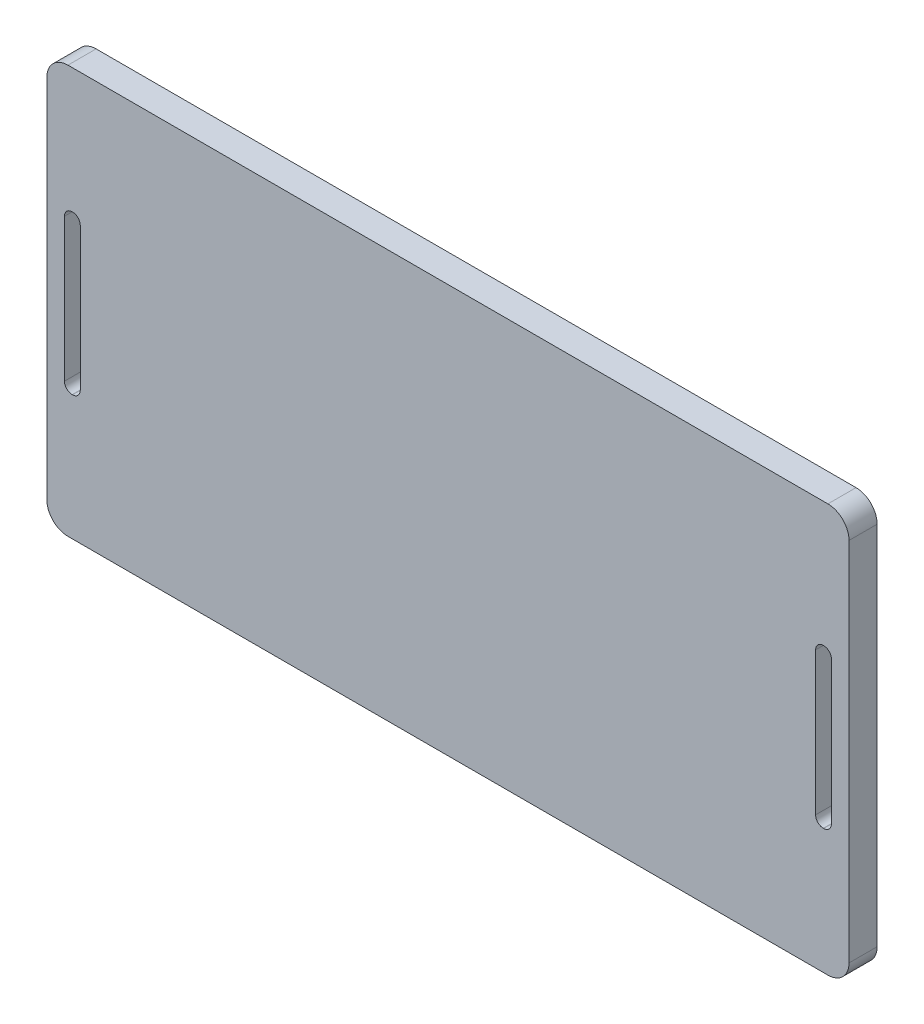
ISO-10303-21;
HEADER;
FILE_DESCRIPTION(('STEP AP214'),'2;1');
FILE_NAME('part.step','',(''),(''),'','','');
FILE_SCHEMA(('AUTOMOTIVE_DESIGN { 1 0 10303 214 1 1 1 1 }'));
ENDSEC;
DATA;
#1=APPLICATION_CONTEXT('core data for automotive mechanical design processes');
#2=APPLICATION_PROTOCOL_DEFINITION('international standard','automotive_design',2000,#1);
#3=PRODUCT_CONTEXT('',#1,'mechanical');
#4=PRODUCT('Part','Part','',(#3));
#5=PRODUCT_RELATED_PRODUCT_CATEGORY('part','',(#4));
#6=PRODUCT_DEFINITION_FORMATION('','',#4);
#7=PRODUCT_DEFINITION_CONTEXT('part definition',#1,'design');
#8=PRODUCT_DEFINITION('design','',#6,#7);
#9=PRODUCT_DEFINITION_SHAPE('','',#8);
#10=(LENGTH_UNIT() NAMED_UNIT(*) SI_UNIT(.MILLI.,.METRE.));
#11=(NAMED_UNIT(*) PLANE_ANGLE_UNIT() SI_UNIT($,.RADIAN.));
#12=(NAMED_UNIT(*) SI_UNIT($,.STERADIAN.) SOLID_ANGLE_UNIT());
#13=UNCERTAINTY_MEASURE_WITH_UNIT(LENGTH_MEASURE(1.E-05),#10,'distance_accuracy_value','');
#14=(GEOMETRIC_REPRESENTATION_CONTEXT(3) GLOBAL_UNCERTAINTY_ASSIGNED_CONTEXT((#13)) GLOBAL_UNIT_ASSIGNED_CONTEXT((#10,
#11,#12)) REPRESENTATION_CONTEXT('',''));
#15=CARTESIAN_POINT('',(0.,0.,0.));
#16=DIRECTION('',(0.,0.,1.));
#17=DIRECTION('',(1.,0.,0.));
#18=AXIS2_PLACEMENT_3D('',#15,#16,#17);
#19=CARTESIAN_POINT('',(830.835603050682,819.114300050581,8.));
#20=DIRECTION('',(0.,0.,-1.));
#21=DIRECTION('',(-1.,0.,0.));
#22=AXIS2_PLACEMENT_3D('',#19,#20,#21);
#23=CYLINDRICAL_SURFACE('',#22,6.00000000000001);
#24=CARTESIAN_POINT('',(830.835603050682,819.114300050581,0.));
#25=DIRECTION('',(0.,0.,1.));
#26=DIRECTION('',(-1.,0.,0.));
#27=AXIS2_PLACEMENT_3D('',#24,#25,#26);
#28=CIRCLE('',#27,6.00000000000001);
#29=CARTESIAN_POINT('',(836.835603050682,819.114300050581,0.));
#30=VERTEX_POINT('',#29);
#31=CARTESIAN_POINT('',(830.835603050682,825.114300050581,0.));
#32=VERTEX_POINT('',#31);
#33=EDGE_CURVE('E334',#30,#32,#28,.T.);
#34=ORIENTED_EDGE('',*,*,#33,.T.);
#35=DIRECTION('',(0.,0.,-1.));
#36=VECTOR('',#35,1.);
#37=CARTESIAN_POINT('',(830.835603050682,825.114300050581,8.));
#38=LINE('',#37,#36);
#39=CARTESIAN_POINT('',(830.835603050682,825.114300050581,8.));
#40=VERTEX_POINT('',#39);
#41=EDGE_CURVE('E11',#40,#32,#38,.T.);
#42=ORIENTED_EDGE('',*,*,#41,.F.);
#43=CARTESIAN_POINT('',(830.835603050682,819.114300050581,8.));
#44=DIRECTION('',(0.,0.,1.));
#45=DIRECTION('',(-1.,0.,0.));
#46=AXIS2_PLACEMENT_3D('',#43,#44,#45);
#47=CIRCLE('',#46,6.00000000000001);
#48=CARTESIAN_POINT('',(836.835603050682,819.114300050581,8.));
#49=VERTEX_POINT('',#48);
#50=EDGE_CURVE('E331',#49,#40,#47,.T.);
#51=ORIENTED_EDGE('',*,*,#50,.F.);
#52=DIRECTION('',(0.,0.,-1.));
#53=VECTOR('',#52,1.);
#54=CARTESIAN_POINT('',(836.835603050682,819.114300050581,8.));
#55=LINE('',#54,#53);
#56=EDGE_CURVE('E355',#49,#30,#55,.T.);
#57=ORIENTED_EDGE('',*,*,#56,.T.);
#58=EDGE_LOOP('',(#34,#42,#51,#57));
#59=FACE_BOUND('',#58,.T.);
#60=ADVANCED_FACE('F36',(#59),#23,.T.);
#61=CARTESIAN_POINT('',(614.835603050682,825.114300050581,8.));
#62=DIRECTION('',(0.,-1.,0.));
#63=DIRECTION('',(0.,0.,-1.));
#64=AXIS2_PLACEMENT_3D('',#61,#62,#63);
#65=PLANE('',#64);
#66=DIRECTION('',(-1.,0.,0.));
#67=VECTOR('',#66,1.);
#68=CARTESIAN_POINT('',(614.835603050682,825.114300050581,0.));
#69=LINE('',#68,#67);
#70=CARTESIAN_POINT('',(614.835603050682,825.114300050581,0.));
#71=VERTEX_POINT('',#70);
#72=EDGE_CURVE('E353',#32,#71,#69,.T.);
#73=ORIENTED_EDGE('',*,*,#72,.T.);
#74=DIRECTION('',(0.,0.,-1.));
#75=VECTOR('',#74,1.);
#76=CARTESIAN_POINT('',(614.835603050682,825.114300050581,8.));
#77=LINE('',#76,#75);
#78=CARTESIAN_POINT('',(614.835603050682,825.114300050581,8.));
#79=VERTEX_POINT('',#78);
#80=EDGE_CURVE('E44',#79,#71,#77,.T.);
#81=ORIENTED_EDGE('',*,*,#80,.F.);
#82=DIRECTION('',(-1.,0.,0.));
#83=VECTOR('',#82,1.);
#84=CARTESIAN_POINT('',(614.835603050682,825.114300050581,8.));
#85=LINE('',#84,#83);
#86=EDGE_CURVE('E340',#40,#79,#85,.T.);
#87=ORIENTED_EDGE('',*,*,#86,.F.);
#88=ORIENTED_EDGE('',*,*,#41,.T.);
#89=EDGE_LOOP('',(#73,#81,#87,#88));
#90=FACE_BOUND('',#89,.T.);
#91=ADVANCED_FACE('F411',(#90),#65,.F.);
#92=CARTESIAN_POINT('',(614.835603050682,819.114300050581,8.));
#93=DIRECTION('',(0.,0.,-1.));
#94=DIRECTION('',(-1.,0.,0.));
#95=AXIS2_PLACEMENT_3D('',#92,#93,#94);
#96=CYLINDRICAL_SURFACE('',#95,6.00000000000001);
#97=CARTESIAN_POINT('',(614.835603050682,819.114300050581,0.));
#98=DIRECTION('',(0.,0.,1.));
#99=DIRECTION('',(1.,0.,0.));
#100=AXIS2_PLACEMENT_3D('',#97,#98,#99);
#101=CIRCLE('',#100,6.00000000000001);
#102=CARTESIAN_POINT('',(608.835603050682,819.114300050581,0.));
#103=VERTEX_POINT('',#102);
#104=EDGE_CURVE('E360',#71,#103,#101,.T.);
#105=ORIENTED_EDGE('',*,*,#104,.T.);
#106=DIRECTION('',(0.,0.,-1.));
#107=VECTOR('',#106,1.);
#108=CARTESIAN_POINT('',(608.835603050682,819.114300050581,8.));
#109=LINE('',#108,#107);
#110=CARTESIAN_POINT('',(608.835603050682,819.114300050581,8.));
#111=VERTEX_POINT('',#110);
#112=EDGE_CURVE('E385',#111,#103,#109,.T.);
#113=ORIENTED_EDGE('',*,*,#112,.F.);
#114=CARTESIAN_POINT('',(614.835603050682,819.114300050581,8.));
#115=DIRECTION('',(0.,0.,1.));
#116=DIRECTION('',(1.,0.,0.));
#117=AXIS2_PLACEMENT_3D('',#114,#115,#116);
#118=CIRCLE('',#117,6.00000000000001);
#119=EDGE_CURVE('E338',#79,#111,#118,.T.);
#120=ORIENTED_EDGE('',*,*,#119,.F.);
#121=ORIENTED_EDGE('',*,*,#80,.T.);
#122=EDGE_LOOP('',(#105,#113,#120,#121));
#123=FACE_BOUND('',#122,.T.);
#124=ADVANCED_FACE('F386',(#123),#96,.T.);
#125=CARTESIAN_POINT('',(608.835603050682,715.114300050581,8.));
#126=DIRECTION('',(1.,0.,0.));
#127=DIRECTION('',(0.,0.,-1.));
#128=AXIS2_PLACEMENT_3D('',#125,#126,#127);
#129=PLANE('',#128);
#130=DIRECTION('',(0.,-1.,0.));
#131=VECTOR('',#130,1.);
#132=CARTESIAN_POINT('',(608.835603050682,715.114300050581,0.));
#133=LINE('',#132,#131);
#134=CARTESIAN_POINT('',(608.835603050682,715.114300050581,0.));
#135=VERTEX_POINT('',#134);
#136=EDGE_CURVE('E357',#103,#135,#133,.T.);
#137=ORIENTED_EDGE('',*,*,#136,.T.);
#138=DIRECTION('',(0.,0.,-1.));
#139=VECTOR('',#138,1.);
#140=CARTESIAN_POINT('',(608.835603050682,715.114300050581,8.));
#141=LINE('',#140,#139);
#142=CARTESIAN_POINT('',(608.835603050682,715.114300050581,8.));
#143=VERTEX_POINT('',#142);
#144=EDGE_CURVE('E377',#143,#135,#141,.T.);
#145=ORIENTED_EDGE('',*,*,#144,.F.);
#146=DIRECTION('',(0.,-1.,0.));
#147=VECTOR('',#146,1.);
#148=CARTESIAN_POINT('',(608.835603050682,715.114300050581,8.));
#149=LINE('',#148,#147);
#150=EDGE_CURVE('E345',#111,#143,#149,.T.);
#151=ORIENTED_EDGE('',*,*,#150,.F.);
#152=ORIENTED_EDGE('',*,*,#112,.T.);
#153=EDGE_LOOP('',(#137,#145,#151,#152));
#154=FACE_BOUND('',#153,.T.);
#155=ADVANCED_FACE('F397',(#154),#129,.F.);
#156=CARTESIAN_POINT('',(614.835603050682,715.114300050581,8.));
#157=DIRECTION('',(0.,0.,-1.));
#158=DIRECTION('',(-1.,0.,0.));
#159=AXIS2_PLACEMENT_3D('',#156,#157,#158);
#160=CYLINDRICAL_SURFACE('',#159,6.00000000000001);
#161=CARTESIAN_POINT('',(614.835603050682,715.114300050581,0.));
#162=DIRECTION('',(0.,0.,1.));
#163=DIRECTION('',(-1.,0.,0.));
#164=AXIS2_PLACEMENT_3D('',#161,#162,#163);
#165=CIRCLE('',#164,6.00000000000001);
#166=CARTESIAN_POINT('',(614.835603050682,709.114300050581,0.));
#167=VERTEX_POINT('',#166);
#168=EDGE_CURVE('E363',#135,#167,#165,.T.);
#169=ORIENTED_EDGE('',*,*,#168,.T.);
#170=DIRECTION('',(0.,0.,-1.));
#171=VECTOR('',#170,1.);
#172=CARTESIAN_POINT('',(614.835603050682,709.114300050581,8.));
#173=LINE('',#172,#171);
#174=CARTESIAN_POINT('',(614.835603050682,709.114300050581,8.));
#175=VERTEX_POINT('',#174);
#176=EDGE_CURVE('E376',#175,#167,#173,.T.);
#177=ORIENTED_EDGE('',*,*,#176,.F.);
#178=CARTESIAN_POINT('',(614.835603050682,715.114300050581,8.));
#179=DIRECTION('',(0.,0.,1.));
#180=DIRECTION('',(-1.,0.,0.));
#181=AXIS2_PLACEMENT_3D('',#178,#179,#180);
#182=CIRCLE('',#181,6.00000000000001);
#183=EDGE_CURVE('E342',#143,#175,#182,.T.);
#184=ORIENTED_EDGE('',*,*,#183,.F.);
#185=ORIENTED_EDGE('',*,*,#144,.T.);
#186=EDGE_LOOP('',(#169,#177,#184,#185));
#187=FACE_BOUND('',#186,.T.);
#188=ADVANCED_FACE('F401',(#187),#160,.T.);
#189=CARTESIAN_POINT('',(614.835603050682,709.114300050581,8.));
#190=DIRECTION('',(0.,1.,0.));
#191=DIRECTION('',(0.,0.,1.));
#192=AXIS2_PLACEMENT_3D('',#189,#190,#191);
#193=PLANE('',#192);
#194=DIRECTION('',(1.,0.,0.));
#195=VECTOR('',#194,1.);
#196=CARTESIAN_POINT('',(614.835603050682,709.114300050581,0.));
#197=LINE('',#196,#195);
#198=CARTESIAN_POINT('',(830.835603050682,709.114300050581,0.));
#199=VERTEX_POINT('',#198);
#200=EDGE_CURVE('E361',#167,#199,#197,.T.);
#201=ORIENTED_EDGE('',*,*,#200,.T.);
#202=DIRECTION('',(0.,0.,-1.));
#203=VECTOR('',#202,1.);
#204=CARTESIAN_POINT('',(830.835603050682,709.114300050581,8.));
#205=LINE('',#204,#203);
#206=CARTESIAN_POINT('',(830.835603050682,709.114300050581,8.));
#207=VERTEX_POINT('',#206);
#208=EDGE_CURVE('E373',#207,#199,#205,.T.);
#209=ORIENTED_EDGE('',*,*,#208,.F.);
#210=DIRECTION('',(1.,0.,0.));
#211=VECTOR('',#210,1.);
#212=CARTESIAN_POINT('',(614.835603050682,709.114300050581,8.));
#213=LINE('',#212,#211);
#214=EDGE_CURVE('E347',#175,#207,#213,.T.);
#215=ORIENTED_EDGE('',*,*,#214,.F.);
#216=ORIENTED_EDGE('',*,*,#176,.T.);
#217=EDGE_LOOP('',(#201,#209,#215,#216));
#218=FACE_BOUND('',#217,.T.);
#219=ADVANCED_FACE('F424',(#218),#193,.F.);
#220=CARTESIAN_POINT('',(830.835603050682,715.114300050581,8.));
#221=DIRECTION('',(0.,0.,-1.));
#222=DIRECTION('',(-1.,0.,0.));
#223=AXIS2_PLACEMENT_3D('',#220,#221,#222);
#224=CYLINDRICAL_SURFACE('',#223,6.00000000000001);
#225=CARTESIAN_POINT('',(830.835603050682,715.114300050581,0.));
#226=DIRECTION('',(0.,0.,1.));
#227=DIRECTION('',(-1.,0.,0.));
#228=AXIS2_PLACEMENT_3D('',#225,#226,#227);
#229=CIRCLE('',#228,6.00000000000001);
#230=CARTESIAN_POINT('',(836.835603050682,715.114300050581,0.));
#231=VERTEX_POINT('',#230);
#232=EDGE_CURVE('E364',#199,#231,#229,.T.);
#233=ORIENTED_EDGE('',*,*,#232,.T.);
#234=DIRECTION('',(0.,0.,-1.));
#235=VECTOR('',#234,1.);
#236=CARTESIAN_POINT('',(836.835603050682,715.114300050581,8.));
#237=LINE('',#236,#235);
#238=CARTESIAN_POINT('',(836.835603050682,715.114300050581,8.));
#239=VERTEX_POINT('',#238);
#240=EDGE_CURVE('E367',#239,#231,#237,.T.);
#241=ORIENTED_EDGE('',*,*,#240,.F.);
#242=CARTESIAN_POINT('',(830.835603050682,715.114300050581,8.));
#243=DIRECTION('',(0.,0.,1.));
#244=DIRECTION('',(-1.,0.,0.));
#245=AXIS2_PLACEMENT_3D('',#242,#243,#244);
#246=CIRCLE('',#245,6.00000000000001);
#247=EDGE_CURVE('E346',#207,#239,#246,.T.);
#248=ORIENTED_EDGE('',*,*,#247,.F.);
#249=ORIENTED_EDGE('',*,*,#208,.T.);
#250=EDGE_LOOP('',(#233,#241,#248,#249));
#251=FACE_BOUND('',#250,.T.);
#252=ADVANCED_FACE('F425',(#251),#224,.T.);
#253=CARTESIAN_POINT('',(836.835603050682,715.114300050581,8.));
#254=DIRECTION('',(-1.,0.,0.));
#255=DIRECTION('',(0.,0.,1.));
#256=AXIS2_PLACEMENT_3D('',#253,#254,#255);
#257=PLANE('',#256);
#258=DIRECTION('',(0.,1.,0.));
#259=VECTOR('',#258,1.);
#260=CARTESIAN_POINT('',(836.835603050682,715.114300050581,0.));
#261=LINE('',#260,#259);
#262=EDGE_CURVE('E339',#231,#30,#261,.T.);
#263=ORIENTED_EDGE('',*,*,#262,.T.);
#264=ORIENTED_EDGE('',*,*,#56,.F.);
#265=DIRECTION('',(0.,1.,0.));
#266=VECTOR('',#265,1.);
#267=CARTESIAN_POINT('',(836.835603050682,715.114300050581,8.));
#268=LINE('',#267,#266);
#269=EDGE_CURVE('E348',#239,#49,#268,.T.);
#270=ORIENTED_EDGE('',*,*,#269,.F.);
#271=ORIENTED_EDGE('',*,*,#240,.T.);
#272=EDGE_LOOP('',(#263,#264,#270,#271));
#273=FACE_BOUND('',#272,.T.);
#274=ADVANCED_FACE('F417',(#273),#257,.F.);
#275=CARTESIAN_POINT('',(830.835603050682,819.114300050581,8.));
#276=DIRECTION('',(0.,0.,-1.));
#277=DIRECTION('',(-1.,0.,0.));
#278=AXIS2_PLACEMENT_3D('',#275,#276,#277);
#279=PLANE('',#278);
#280=DIRECTION('',(0.,-1.,0.));
#281=VECTOR('',#280,1.);
#282=CARTESIAN_POINT('',(618.335603050682,819.114300050581,8.));
#283=LINE('',#282,#281);
#284=CARTESIAN_POINT('',(618.335603050682,787.414300050581,8.));
#285=VERTEX_POINT('',#284);
#286=CARTESIAN_POINT('',(618.335603050682,746.814300050581,8.));
#287=VERTEX_POINT('',#286);
#288=EDGE_CURVE('E330',#285,#287,#283,.T.);
#289=ORIENTED_EDGE('',*,*,#288,.T.);
#290=CARTESIAN_POINT('',(616.135603050682,746.814300050581,8.));
#291=DIRECTION('',(0.,0.,-1.));
#292=DIRECTION('',(-1.,0.,0.));
#293=AXIS2_PLACEMENT_3D('',#290,#291,#292);
#294=CIRCLE('',#293,2.19999999999998);
#295=CARTESIAN_POINT('',(616.135603050682,744.614300050581,8.));
#296=VERTEX_POINT('',#295);
#297=EDGE_CURVE('E329',#287,#296,#294,.T.);
#298=ORIENTED_EDGE('',*,*,#297,.T.);
#299=DIRECTION('',(-1.,1.11022302462528E-12,0.));
#300=VECTOR('',#299,1.);
#301=CARTESIAN_POINT('',(830.835603050599,744.614300050343,8.));
#302=LINE('',#301,#300);
#303=CARTESIAN_POINT('',(616.035603050682,744.614300050581,8.));
#304=VERTEX_POINT('',#303);
#305=EDGE_CURVE('E315',#296,#304,#302,.T.);
#306=ORIENTED_EDGE('',*,*,#305,.T.);
#307=CARTESIAN_POINT('',(616.035603050682,746.814300050581,8.));
#308=DIRECTION('',(0.,0.,-1.));
#309=DIRECTION('',(-1.,0.,0.));
#310=AXIS2_PLACEMENT_3D('',#307,#308,#309);
#311=CIRCLE('',#310,2.19999999999998);
#312=CARTESIAN_POINT('',(613.835603050682,746.814300050581,8.));
#313=VERTEX_POINT('',#312);
#314=EDGE_CURVE('E201',#304,#313,#311,.T.);
#315=ORIENTED_EDGE('',*,*,#314,.T.);
#316=DIRECTION('',(0.,1.,0.));
#317=VECTOR('',#316,1.);
#318=CARTESIAN_POINT('',(613.835603050682,819.114300050581,8.));
#319=LINE('',#318,#317);
#320=CARTESIAN_POINT('',(613.835603050682,787.414300050581,8.));
#321=VERTEX_POINT('',#320);
#322=EDGE_CURVE('E312',#313,#321,#319,.T.);
#323=ORIENTED_EDGE('',*,*,#322,.T.);
#324=CARTESIAN_POINT('',(616.035603050682,787.414300050581,8.));
#325=DIRECTION('',(0.,0.,-1.));
#326=DIRECTION('',(-1.,0.,0.));
#327=AXIS2_PLACEMENT_3D('',#324,#325,#326);
#328=CIRCLE('',#327,2.20000000000004);
#329=CARTESIAN_POINT('',(616.035603050682,789.614300050581,8.));
#330=VERTEX_POINT('',#329);
#331=EDGE_CURVE('E318',#321,#330,#328,.T.);
#332=ORIENTED_EDGE('',*,*,#331,.T.);
#333=DIRECTION('',(1.,0.,0.));
#334=VECTOR('',#333,1.);
#335=CARTESIAN_POINT('',(830.835603050682,789.614300050581,8.));
#336=LINE('',#335,#334);
#337=CARTESIAN_POINT('',(616.135603050682,789.614300050581,8.));
#338=VERTEX_POINT('',#337);
#339=EDGE_CURVE('E321',#330,#338,#336,.T.);
#340=ORIENTED_EDGE('',*,*,#339,.T.);
#341=CARTESIAN_POINT('',(616.135603050682,787.414300050581,8.));
#342=DIRECTION('',(0.,0.,-1.));
#343=DIRECTION('',(-1.,0.,0.));
#344=AXIS2_PLACEMENT_3D('',#341,#342,#343);
#345=CIRCLE('',#344,2.19999999999998);
#346=EDGE_CURVE('E322',#338,#285,#345,.T.);
#347=ORIENTED_EDGE('',*,*,#346,.T.);
#348=EDGE_LOOP('',(#289,#298,#306,#315,#323,#332,#340,#347));
#349=FACE_BOUND('',#348,.T.);
#350=DIRECTION('',(0.,1.,0.));
#351=VECTOR('',#350,1.);
#352=CARTESIAN_POINT('',(827.335603050682,819.114300050581,8.));
#353=LINE('',#352,#351);
#354=CARTESIAN_POINT('',(827.335603050682,746.814300050581,8.));
#355=VERTEX_POINT('',#354);
#356=CARTESIAN_POINT('',(827.335603050682,787.414300050581,8.));
#357=VERTEX_POINT('',#356);
#358=EDGE_CURVE('E308',#355,#357,#353,.T.);
#359=ORIENTED_EDGE('',*,*,#358,.T.);
#360=CARTESIAN_POINT('',(829.535603050682,787.414300050581,8.));
#361=DIRECTION('',(0.,0.,-1.));
#362=DIRECTION('',(-1.,0.,0.));
#363=AXIS2_PLACEMENT_3D('',#360,#361,#362);
#364=CIRCLE('',#363,2.19999999999998);
#365=CARTESIAN_POINT('',(829.535603050682,789.614300050581,8.));
#366=VERTEX_POINT('',#365);
#367=EDGE_CURVE('E310',#357,#366,#364,.T.);
#368=ORIENTED_EDGE('',*,*,#367,.T.);
#369=DIRECTION('',(1.,0.,0.));
#370=VECTOR('',#369,1.);
#371=CARTESIAN_POINT('',(830.835603050682,789.614300050581,8.));
#372=LINE('',#371,#370);
#373=CARTESIAN_POINT('',(829.635603050682,789.614300050581,8.));
#374=VERTEX_POINT('',#373);
#375=EDGE_CURVE('E238',#366,#374,#372,.T.);
#376=ORIENTED_EDGE('',*,*,#375,.T.);
#377=CARTESIAN_POINT('',(829.635603050682,787.414300050581,8.));
#378=DIRECTION('',(0.,0.,-1.));
#379=DIRECTION('',(-1.,0.,0.));
#380=AXIS2_PLACEMENT_3D('',#377,#378,#379);
#381=CIRCLE('',#380,2.20000000000004);
#382=CARTESIAN_POINT('',(831.835603050682,787.414300050581,8.));
#383=VERTEX_POINT('',#382);
#384=EDGE_CURVE('E292',#374,#383,#381,.T.);
#385=ORIENTED_EDGE('',*,*,#384,.T.);
#386=DIRECTION('',(0.,-1.,0.));
#387=VECTOR('',#386,1.);
#388=CARTESIAN_POINT('',(831.835603050682,819.114300050581,8.));
#389=LINE('',#388,#387);
#390=CARTESIAN_POINT('',(831.835603050682,746.814300050581,8.));
#391=VERTEX_POINT('',#390);
#392=EDGE_CURVE('E294',#383,#391,#389,.T.);
#393=ORIENTED_EDGE('',*,*,#392,.T.);
#394=CARTESIAN_POINT('',(829.635603050682,746.814300050581,8.));
#395=DIRECTION('',(0.,0.,-1.));
#396=DIRECTION('',(-1.,0.,0.));
#397=AXIS2_PLACEMENT_3D('',#394,#395,#396);
#398=CIRCLE('',#397,2.19999999999998);
#399=CARTESIAN_POINT('',(829.635603050682,744.614300050581,8.));
#400=VERTEX_POINT('',#399);
#401=EDGE_CURVE('E300',#391,#400,#398,.T.);
#402=ORIENTED_EDGE('',*,*,#401,.T.);
#403=DIRECTION('',(-1.,-1.11022302462528E-12,0.));
#404=VECTOR('',#403,1.);
#405=CARTESIAN_POINT('',(830.835603050764,744.614300050583,8.));
#406=LINE('',#405,#404);
#407=CARTESIAN_POINT('',(829.535603050682,744.614300050581,8.));
#408=VERTEX_POINT('',#407);
#409=EDGE_CURVE('E298',#400,#408,#406,.T.);
#410=ORIENTED_EDGE('',*,*,#409,.T.);
#411=CARTESIAN_POINT('',(829.535603050682,746.814300050581,8.));
#412=DIRECTION('',(0.,0.,-1.));
#413=DIRECTION('',(-1.,0.,0.));
#414=AXIS2_PLACEMENT_3D('',#411,#412,#413);
#415=CIRCLE('',#414,2.19999999999998);
#416=EDGE_CURVE('E303',#408,#355,#415,.T.);
#417=ORIENTED_EDGE('',*,*,#416,.T.);
#418=EDGE_LOOP('',(#359,#368,#376,#385,#393,#402,#410,#417));
#419=FACE_BOUND('',#418,.T.);
#420=ORIENTED_EDGE('',*,*,#50,.T.);
#421=ORIENTED_EDGE('',*,*,#86,.T.);
#422=ORIENTED_EDGE('',*,*,#119,.T.);
#423=ORIENTED_EDGE('',*,*,#150,.T.);
#424=ORIENTED_EDGE('',*,*,#183,.T.);
#425=ORIENTED_EDGE('',*,*,#214,.T.);
#426=ORIENTED_EDGE('',*,*,#247,.T.);
#427=ORIENTED_EDGE('',*,*,#269,.T.);
#428=EDGE_LOOP('',(#420,#421,#422,#423,#424,#425,#426,#427));
#429=FACE_BOUND('',#428,.T.);
#430=ADVANCED_FACE('F410',(#349,#419,#429),#279,.F.);
#431=CARTESIAN_POINT('',(830.835603050682,819.114300050581,0.));
#432=DIRECTION('',(0.,0.,-1.));
#433=DIRECTION('',(-1.,0.,0.));
#434=AXIS2_PLACEMENT_3D('',#431,#432,#433);
#435=PLANE('',#434);
#436=CARTESIAN_POINT('',(616.135603050682,746.814300050581,0.));
#437=DIRECTION('',(0.,0.,-1.));
#438=DIRECTION('',(1.,0.,0.));
#439=AXIS2_PLACEMENT_3D('',#436,#437,#438);
#440=CIRCLE('',#439,2.19999999999998);
#441=CARTESIAN_POINT('',(618.335603050682,746.814300050581,0.));
#442=VERTEX_POINT('',#441);
#443=CARTESIAN_POINT('',(616.135603050682,744.614300050581,0.));
#444=VERTEX_POINT('',#443);
#445=EDGE_CURVE('E214',#442,#444,#440,.T.);
#446=ORIENTED_EDGE('',*,*,#445,.F.);
#447=DIRECTION('',(0.,-1.,0.));
#448=VECTOR('',#447,1.);
#449=CARTESIAN_POINT('',(618.335603050682,746.814300050581,0.));
#450=LINE('',#449,#448);
#451=CARTESIAN_POINT('',(618.335603050682,787.414300050581,0.));
#452=VERTEX_POINT('',#451);
#453=EDGE_CURVE('E234',#452,#442,#450,.T.);
#454=ORIENTED_EDGE('',*,*,#453,.F.);
#455=CARTESIAN_POINT('',(616.135603050682,787.414300050581,0.));
#456=DIRECTION('',(0.,0.,-1.));
#457=DIRECTION('',(-1.,0.,0.));
#458=AXIS2_PLACEMENT_3D('',#455,#456,#457);
#459=CIRCLE('',#458,2.19999999999998);
#460=CARTESIAN_POINT('',(616.135603050682,789.614300050581,0.));
#461=VERTEX_POINT('',#460);
#462=EDGE_CURVE('E235',#461,#452,#459,.T.);
#463=ORIENTED_EDGE('',*,*,#462,.F.);
#464=DIRECTION('',(1.,0.,0.));
#465=VECTOR('',#464,1.);
#466=CARTESIAN_POINT('',(616.135603050682,789.614300050581,0.));
#467=LINE('',#466,#465);
#468=CARTESIAN_POINT('',(616.035603050682,789.614300050581,0.));
#469=VERTEX_POINT('',#468);
#470=EDGE_CURVE('E226',#469,#461,#467,.T.);
#471=ORIENTED_EDGE('',*,*,#470,.F.);
#472=CARTESIAN_POINT('',(616.035603050682,787.414300050581,0.));
#473=DIRECTION('',(0.,0.,-1.));
#474=DIRECTION('',(-1.,0.,0.));
#475=AXIS2_PLACEMENT_3D('',#472,#473,#474);
#476=CIRCLE('',#475,2.20000000000004);
#477=CARTESIAN_POINT('',(613.835603050682,787.414300050581,0.));
#478=VERTEX_POINT('',#477);
#479=EDGE_CURVE('E224',#478,#469,#476,.T.);
#480=ORIENTED_EDGE('',*,*,#479,.F.);
#481=DIRECTION('',(0.,1.,0.));
#482=VECTOR('',#481,1.);
#483=CARTESIAN_POINT('',(613.835603050682,746.814300050581,0.));
#484=LINE('',#483,#482);
#485=CARTESIAN_POINT('',(613.835603050682,746.814300050581,0.));
#486=VERTEX_POINT('',#485);
#487=EDGE_CURVE('E222',#486,#478,#484,.T.);
#488=ORIENTED_EDGE('',*,*,#487,.F.);
#489=CARTESIAN_POINT('',(616.035603050682,746.814300050581,0.));
#490=DIRECTION('',(0.,0.,-1.));
#491=DIRECTION('',(-1.,0.,0.));
#492=AXIS2_PLACEMENT_3D('',#489,#490,#491);
#493=CIRCLE('',#492,2.19999999999998);
#494=CARTESIAN_POINT('',(616.035603050682,744.614300050581,0.));
#495=VERTEX_POINT('',#494);
#496=EDGE_CURVE('E199',#495,#486,#493,.T.);
#497=ORIENTED_EDGE('',*,*,#496,.F.);
#498=DIRECTION('',(-1.,1.11022302462528E-12,0.));
#499=VECTOR('',#498,1.);
#500=CARTESIAN_POINT('',(616.135603050682,744.614300050581,0.));
#501=LINE('',#500,#499);
#502=EDGE_CURVE('E209',#444,#495,#501,.T.);
#503=ORIENTED_EDGE('',*,*,#502,.F.);
#504=EDGE_LOOP('',(#446,#454,#463,#471,#480,#488,#497,#503));
#505=FACE_BOUND('',#504,.T.);
#506=CARTESIAN_POINT('',(829.535603050682,787.414300050581,0.));
#507=DIRECTION('',(0.,0.,-1.));
#508=DIRECTION('',(1.,0.,0.));
#509=AXIS2_PLACEMENT_3D('',#506,#507,#508);
#510=CIRCLE('',#509,2.19999999999998);
#511=CARTESIAN_POINT('',(827.335603050682,787.414300050581,0.));
#512=VERTEX_POINT('',#511);
#513=CARTESIAN_POINT('',(829.535603050682,789.614300050581,0.));
#514=VERTEX_POINT('',#513);
#515=EDGE_CURVE('E290',#512,#514,#510,.T.);
#516=ORIENTED_EDGE('',*,*,#515,.F.);
#517=DIRECTION('',(0.,1.,0.));
#518=VECTOR('',#517,1.);
#519=CARTESIAN_POINT('',(827.335603050682,746.814300050581,0.));
#520=LINE('',#519,#518);
#521=CARTESIAN_POINT('',(827.335603050682,746.814300050581,0.));
#522=VERTEX_POINT('',#521);
#523=EDGE_CURVE('E255',#522,#512,#520,.T.);
#524=ORIENTED_EDGE('',*,*,#523,.F.);
#525=CARTESIAN_POINT('',(829.535603050682,746.814300050581,0.));
#526=DIRECTION('',(0.,0.,-1.));
#527=DIRECTION('',(-1.,0.,0.));
#528=AXIS2_PLACEMENT_3D('',#525,#526,#527);
#529=CIRCLE('',#528,2.19999999999998);
#530=CARTESIAN_POINT('',(829.535603050682,744.614300050581,0.));
#531=VERTEX_POINT('',#530);
#532=EDGE_CURVE('E269',#531,#522,#529,.T.);
#533=ORIENTED_EDGE('',*,*,#532,.F.);
#534=DIRECTION('',(-1.,-1.11022302462528E-12,0.));
#535=VECTOR('',#534,1.);
#536=CARTESIAN_POINT('',(829.535603050682,744.614300050581,0.));
#537=LINE('',#536,#535);
#538=CARTESIAN_POINT('',(829.635603050682,744.614300050581,0.));
#539=VERTEX_POINT('',#538);
#540=EDGE_CURVE('E272',#539,#531,#537,.T.);
#541=ORIENTED_EDGE('',*,*,#540,.F.);
#542=CARTESIAN_POINT('',(829.635603050682,746.814300050581,0.));
#543=DIRECTION('',(0.,0.,-1.));
#544=DIRECTION('',(1.,0.,0.));
#545=AXIS2_PLACEMENT_3D('',#542,#543,#544);
#546=CIRCLE('',#545,2.19999999999998);
#547=CARTESIAN_POINT('',(831.835603050682,746.814300050581,0.));
#548=VERTEX_POINT('',#547);
#549=EDGE_CURVE('E277',#548,#539,#546,.T.);
#550=ORIENTED_EDGE('',*,*,#549,.F.);
#551=DIRECTION('',(0.,-1.,0.));
#552=VECTOR('',#551,1.);
#553=CARTESIAN_POINT('',(831.835603050682,746.814300050581,0.));
#554=LINE('',#553,#552);
#555=CARTESIAN_POINT('',(831.835603050682,787.414300050581,0.));
#556=VERTEX_POINT('',#555);
#557=EDGE_CURVE('E276',#556,#548,#554,.T.);
#558=ORIENTED_EDGE('',*,*,#557,.F.);
#559=CARTESIAN_POINT('',(829.635603050682,787.414300050581,0.));
#560=DIRECTION('',(0.,0.,-1.));
#561=DIRECTION('',(1.,0.,0.));
#562=AXIS2_PLACEMENT_3D('',#559,#560,#561);
#563=CIRCLE('',#562,2.20000000000004);
#564=CARTESIAN_POINT('',(829.635603050682,789.614300050581,0.));
#565=VERTEX_POINT('',#564);
#566=EDGE_CURVE('E285',#565,#556,#563,.T.);
#567=ORIENTED_EDGE('',*,*,#566,.F.);
#568=DIRECTION('',(1.,0.,0.));
#569=VECTOR('',#568,1.);
#570=CARTESIAN_POINT('',(829.535603050682,789.614300050581,0.));
#571=LINE('',#570,#569);
#572=EDGE_CURVE('E283',#514,#565,#571,.T.);
#573=ORIENTED_EDGE('',*,*,#572,.F.);
#574=EDGE_LOOP('',(#516,#524,#533,#541,#550,#558,#567,#573));
#575=FACE_BOUND('',#574,.T.);
#576=ORIENTED_EDGE('',*,*,#33,.F.);
#577=ORIENTED_EDGE('',*,*,#262,.F.);
#578=ORIENTED_EDGE('',*,*,#232,.F.);
#579=ORIENTED_EDGE('',*,*,#200,.F.);
#580=ORIENTED_EDGE('',*,*,#168,.F.);
#581=ORIENTED_EDGE('',*,*,#136,.F.);
#582=ORIENTED_EDGE('',*,*,#104,.F.);
#583=ORIENTED_EDGE('',*,*,#72,.F.);
#584=EDGE_LOOP('',(#576,#577,#578,#579,#580,#581,#582,#583));
#585=FACE_BOUND('',#584,.T.);
#586=ADVANCED_FACE('F220',(#505,#575,#585),#435,.T.);
#587=CARTESIAN_POINT('',(829.535603050682,787.414300050581,10.));
#588=DIRECTION('',(0.,0.,-1.));
#589=DIRECTION('',(-1.,0.,0.));
#590=AXIS2_PLACEMENT_3D('',#587,#588,#589);
#591=CYLINDRICAL_SURFACE('',#590,2.19999999999998);
#592=DIRECTION('',(0.,0.,-1.));
#593=VECTOR('',#592,1.);
#594=CARTESIAN_POINT('',(827.335603050682,787.414300050581,10.));
#595=LINE('',#594,#593);
#596=EDGE_CURVE('E266',#357,#512,#595,.T.);
#597=ORIENTED_EDGE('',*,*,#596,.T.);
#598=ORIENTED_EDGE('',*,*,#515,.T.);
#599=DIRECTION('',(0.,0.,-1.));
#600=VECTOR('',#599,1.);
#601=CARTESIAN_POINT('',(829.535603050682,789.614300050581,10.));
#602=LINE('',#601,#600);
#603=EDGE_CURVE('E253',#366,#514,#602,.T.);
#604=ORIENTED_EDGE('',*,*,#603,.F.);
#605=ORIENTED_EDGE('',*,*,#367,.F.);
#606=EDGE_LOOP('',(#597,#598,#604,#605));
#607=FACE_BOUND('',#606,.T.);
#608=ADVANCED_FACE('F487',(#607),#591,.F.);
#609=CARTESIAN_POINT('',(827.335603050682,746.814300050581,10.));
#610=DIRECTION('',(-1.,0.,0.));
#611=DIRECTION('',(0.,0.,1.));
#612=AXIS2_PLACEMENT_3D('',#609,#610,#611);
#613=PLANE('',#612);
#614=DIRECTION('',(0.,0.,-1.));
#615=VECTOR('',#614,1.);
#616=CARTESIAN_POINT('',(827.335603050682,746.814300050581,10.));
#617=LINE('',#616,#615);
#618=EDGE_CURVE('E262',#355,#522,#617,.T.);
#619=ORIENTED_EDGE('',*,*,#618,.T.);
#620=ORIENTED_EDGE('',*,*,#523,.T.);
#621=ORIENTED_EDGE('',*,*,#596,.F.);
#622=ORIENTED_EDGE('',*,*,#358,.F.);
#623=EDGE_LOOP('',(#619,#620,#621,#622));
#624=FACE_BOUND('',#623,.T.);
#625=ADVANCED_FACE('F499',(#624),#613,.F.);
#626=CARTESIAN_POINT('',(829.535603050682,746.814300050581,10.));
#627=DIRECTION('',(0.,0.,-1.));
#628=DIRECTION('',(-1.,0.,0.));
#629=AXIS2_PLACEMENT_3D('',#626,#627,#628);
#630=CYLINDRICAL_SURFACE('',#629,2.19999999999998);
#631=DIRECTION('',(0.,0.,-1.));
#632=VECTOR('',#631,1.);
#633=CARTESIAN_POINT('',(829.535603050682,744.614300050581,10.));
#634=LINE('',#633,#632);
#635=EDGE_CURVE('E265',#408,#531,#634,.T.);
#636=ORIENTED_EDGE('',*,*,#635,.T.);
#637=ORIENTED_EDGE('',*,*,#532,.T.);
#638=ORIENTED_EDGE('',*,*,#618,.F.);
#639=ORIENTED_EDGE('',*,*,#416,.F.);
#640=EDGE_LOOP('',(#636,#637,#638,#639));
#641=FACE_BOUND('',#640,.T.);
#642=ADVANCED_FACE('F508',(#641),#630,.F.);
#643=CARTESIAN_POINT('',(829.535603050682,744.614300050581,10.));
#644=DIRECTION('',(1.11022302462528E-12,-1.,0.));
#645=DIRECTION('',(1.,1.11022302462528E-12,0.));
#646=AXIS2_PLACEMENT_3D('',#643,#644,#645);
#647=PLANE('',#646);
#648=DIRECTION('',(0.,0.,-1.));
#649=VECTOR('',#648,1.);
#650=CARTESIAN_POINT('',(829.635603050682,744.614300050581,10.));
#651=LINE('',#650,#649);
#652=EDGE_CURVE('E257',#400,#539,#651,.T.);
#653=ORIENTED_EDGE('',*,*,#652,.T.);
#654=ORIENTED_EDGE('',*,*,#540,.T.);
#655=ORIENTED_EDGE('',*,*,#635,.F.);
#656=ORIENTED_EDGE('',*,*,#409,.F.);
#657=EDGE_LOOP('',(#653,#654,#655,#656));
#658=FACE_BOUND('',#657,.T.);
#659=ADVANCED_FACE('F519',(#658),#647,.F.);
#660=CARTESIAN_POINT('',(829.635603050682,746.814300050581,10.));
#661=DIRECTION('',(0.,0.,-1.));
#662=DIRECTION('',(-1.,0.,0.));
#663=AXIS2_PLACEMENT_3D('',#660,#661,#662);
#664=CYLINDRICAL_SURFACE('',#663,2.19999999999998);
#665=DIRECTION('',(0.,0.,-1.));
#666=VECTOR('',#665,1.);
#667=CARTESIAN_POINT('',(831.835603050682,746.814300050581,10.));
#668=LINE('',#667,#666);
#669=EDGE_CURVE('E256',#391,#548,#668,.T.);
#670=ORIENTED_EDGE('',*,*,#669,.T.);
#671=ORIENTED_EDGE('',*,*,#549,.T.);
#672=ORIENTED_EDGE('',*,*,#652,.F.);
#673=ORIENTED_EDGE('',*,*,#401,.F.);
#674=EDGE_LOOP('',(#670,#671,#672,#673));
#675=FACE_BOUND('',#674,.T.);
#676=ADVANCED_FACE('F526',(#675),#664,.F.);
#677=CARTESIAN_POINT('',(831.835603050682,746.814300050581,10.));
#678=DIRECTION('',(1.,0.,0.));
#679=DIRECTION('',(0.,0.,-1.));
#680=AXIS2_PLACEMENT_3D('',#677,#678,#679);
#681=PLANE('',#680);
#682=DIRECTION('',(0.,0.,-1.));
#683=VECTOR('',#682,1.);
#684=CARTESIAN_POINT('',(831.835603050682,787.414300050581,10.));
#685=LINE('',#684,#683);
#686=EDGE_CURVE('E258',#383,#556,#685,.T.);
#687=ORIENTED_EDGE('',*,*,#686,.T.);
#688=ORIENTED_EDGE('',*,*,#557,.T.);
#689=ORIENTED_EDGE('',*,*,#669,.F.);
#690=ORIENTED_EDGE('',*,*,#392,.F.);
#691=EDGE_LOOP('',(#687,#688,#689,#690));
#692=FACE_BOUND('',#691,.T.);
#693=ADVANCED_FACE('F538',(#692),#681,.F.);
#694=CARTESIAN_POINT('',(829.635603050682,787.414300050581,10.));
#695=DIRECTION('',(0.,0.,-1.));
#696=DIRECTION('',(-1.,0.,0.));
#697=AXIS2_PLACEMENT_3D('',#694,#695,#696);
#698=CYLINDRICAL_SURFACE('',#697,2.20000000000004);
#699=DIRECTION('',(0.,0.,-1.));
#700=VECTOR('',#699,1.);
#701=CARTESIAN_POINT('',(829.635603050682,789.614300050581,10.));
#702=LINE('',#701,#700);
#703=EDGE_CURVE('E58',#374,#565,#702,.T.);
#704=ORIENTED_EDGE('',*,*,#703,.T.);
#705=ORIENTED_EDGE('',*,*,#566,.T.);
#706=ORIENTED_EDGE('',*,*,#686,.F.);
#707=ORIENTED_EDGE('',*,*,#384,.F.);
#708=EDGE_LOOP('',(#704,#705,#706,#707));
#709=FACE_BOUND('',#708,.T.);
#710=ADVANCED_FACE('F547',(#709),#698,.F.);
#711=CARTESIAN_POINT('',(829.535603050682,789.614300050581,10.));
#712=DIRECTION('',(0.,1.,0.));
#713=DIRECTION('',(0.,0.,1.));
#714=AXIS2_PLACEMENT_3D('',#711,#712,#713);
#715=PLANE('',#714);
#716=ORIENTED_EDGE('',*,*,#603,.T.);
#717=ORIENTED_EDGE('',*,*,#572,.T.);
#718=ORIENTED_EDGE('',*,*,#703,.F.);
#719=ORIENTED_EDGE('',*,*,#375,.F.);
#720=EDGE_LOOP('',(#716,#717,#718,#719));
#721=FACE_BOUND('',#720,.T.);
#722=ADVANCED_FACE('F559',(#721),#715,.F.);
#723=CARTESIAN_POINT('',(616.135603050682,746.814300050581,10.));
#724=DIRECTION('',(0.,0.,-1.));
#725=DIRECTION('',(-1.,0.,0.));
#726=AXIS2_PLACEMENT_3D('',#723,#724,#725);
#727=CYLINDRICAL_SURFACE('',#726,2.19999999999998);
#728=DIRECTION('',(0.,0.,-1.));
#729=VECTOR('',#728,1.);
#730=CARTESIAN_POINT('',(618.335603050682,746.814300050581,10.));
#731=LINE('',#730,#729);
#732=EDGE_CURVE('E236',#287,#442,#731,.T.);
#733=ORIENTED_EDGE('',*,*,#732,.T.);
#734=ORIENTED_EDGE('',*,*,#445,.T.);
#735=DIRECTION('',(0.,0.,-1.));
#736=VECTOR('',#735,1.);
#737=CARTESIAN_POINT('',(616.135603050682,744.614300050581,10.));
#738=LINE('',#737,#736);
#739=EDGE_CURVE('E206',#296,#444,#738,.T.);
#740=ORIENTED_EDGE('',*,*,#739,.F.);
#741=ORIENTED_EDGE('',*,*,#297,.F.);
#742=EDGE_LOOP('',(#733,#734,#740,#741));
#743=FACE_BOUND('',#742,.T.);
#744=ADVANCED_FACE('F566',(#743),#727,.F.);
#745=CARTESIAN_POINT('',(618.335603050682,746.814300050581,10.));
#746=DIRECTION('',(1.,0.,0.));
#747=DIRECTION('',(0.,0.,-1.));
#748=AXIS2_PLACEMENT_3D('',#745,#746,#747);
#749=PLANE('',#748);
#750=DIRECTION('',(0.,0.,-1.));
#751=VECTOR('',#750,1.);
#752=CARTESIAN_POINT('',(618.335603050682,787.414300050581,10.));
#753=LINE('',#752,#751);
#754=EDGE_CURVE('E242',#285,#452,#753,.T.);
#755=ORIENTED_EDGE('',*,*,#754,.T.);
#756=ORIENTED_EDGE('',*,*,#453,.T.);
#757=ORIENTED_EDGE('',*,*,#732,.F.);
#758=ORIENTED_EDGE('',*,*,#288,.F.);
#759=EDGE_LOOP('',(#755,#756,#757,#758));
#760=FACE_BOUND('',#759,.T.);
#761=ADVANCED_FACE('F580',(#760),#749,.F.);
#762=CARTESIAN_POINT('',(616.135603050682,787.414300050581,10.));
#763=DIRECTION('',(0.,0.,-1.));
#764=DIRECTION('',(-1.,0.,0.));
#765=AXIS2_PLACEMENT_3D('',#762,#763,#764);
#766=CYLINDRICAL_SURFACE('',#765,2.19999999999998);
#767=DIRECTION('',(0.,0.,-1.));
#768=VECTOR('',#767,1.);
#769=CARTESIAN_POINT('',(616.135603050682,789.614300050581,10.));
#770=LINE('',#769,#768);
#771=EDGE_CURVE('E244',#338,#461,#770,.T.);
#772=ORIENTED_EDGE('',*,*,#771,.T.);
#773=ORIENTED_EDGE('',*,*,#462,.T.);
#774=ORIENTED_EDGE('',*,*,#754,.F.);
#775=ORIENTED_EDGE('',*,*,#346,.F.);
#776=EDGE_LOOP('',(#772,#773,#774,#775));
#777=FACE_BOUND('',#776,.T.);
#778=ADVANCED_FACE('F590',(#777),#766,.F.);
#779=CARTESIAN_POINT('',(616.135603050682,789.614300050581,10.));
#780=DIRECTION('',(0.,1.,0.));
#781=DIRECTION('',(0.,0.,1.));
#782=AXIS2_PLACEMENT_3D('',#779,#780,#781);
#783=PLANE('',#782);
#784=DIRECTION('',(0.,0.,-1.));
#785=VECTOR('',#784,1.);
#786=CARTESIAN_POINT('',(616.035603050682,789.614300050581,10.));
#787=LINE('',#786,#785);
#788=EDGE_CURVE('E243',#330,#469,#787,.T.);
#789=ORIENTED_EDGE('',*,*,#788,.T.);
#790=ORIENTED_EDGE('',*,*,#470,.T.);
#791=ORIENTED_EDGE('',*,*,#771,.F.);
#792=ORIENTED_EDGE('',*,*,#339,.F.);
#793=EDGE_LOOP('',(#789,#790,#791,#792));
#794=FACE_BOUND('',#793,.T.);
#795=ADVANCED_FACE('F600',(#794),#783,.F.);
#796=CARTESIAN_POINT('',(616.035603050682,787.414300050581,10.));
#797=DIRECTION('',(0.,0.,-1.));
#798=DIRECTION('',(-1.,0.,0.));
#799=AXIS2_PLACEMENT_3D('',#796,#797,#798);
#800=CYLINDRICAL_SURFACE('',#799,2.20000000000004);
#801=DIRECTION('',(0.,0.,-1.));
#802=VECTOR('',#801,1.);
#803=CARTESIAN_POINT('',(613.835603050682,787.414300050581,10.));
#804=LINE('',#803,#802);
#805=EDGE_CURVE('E250',#321,#478,#804,.T.);
#806=ORIENTED_EDGE('',*,*,#805,.T.);
#807=ORIENTED_EDGE('',*,*,#479,.T.);
#808=ORIENTED_EDGE('',*,*,#788,.F.);
#809=ORIENTED_EDGE('',*,*,#331,.F.);
#810=EDGE_LOOP('',(#806,#807,#808,#809));
#811=FACE_BOUND('',#810,.T.);
#812=ADVANCED_FACE('F610',(#811),#800,.F.);
#813=CARTESIAN_POINT('',(613.835603050682,746.814300050581,10.));
#814=DIRECTION('',(-1.,0.,0.));
#815=DIRECTION('',(0.,0.,1.));
#816=AXIS2_PLACEMENT_3D('',#813,#814,#815);
#817=PLANE('',#816);
#818=DIRECTION('',(0.,0.,-1.));
#819=VECTOR('',#818,1.);
#820=CARTESIAN_POINT('',(613.835603050682,746.814300050581,10.));
#821=LINE('',#820,#819);
#822=EDGE_CURVE('E202',#313,#486,#821,.T.);
#823=ORIENTED_EDGE('',*,*,#822,.T.);
#824=ORIENTED_EDGE('',*,*,#487,.T.);
#825=ORIENTED_EDGE('',*,*,#805,.F.);
#826=ORIENTED_EDGE('',*,*,#322,.F.);
#827=EDGE_LOOP('',(#823,#824,#825,#826));
#828=FACE_BOUND('',#827,.T.);
#829=ADVANCED_FACE('F620',(#828),#817,.F.);
#830=CARTESIAN_POINT('',(616.035603050682,746.814300050581,10.));
#831=DIRECTION('',(0.,0.,-1.));
#832=DIRECTION('',(-1.,0.,0.));
#833=AXIS2_PLACEMENT_3D('',#830,#831,#832);
#834=CYLINDRICAL_SURFACE('',#833,2.19999999999998);
#835=DIRECTION('',(0.,0.,-1.));
#836=VECTOR('',#835,1.);
#837=CARTESIAN_POINT('',(616.035603050682,744.614300050581,10.));
#838=LINE('',#837,#836);
#839=EDGE_CURVE('E55',#304,#495,#838,.T.);
#840=ORIENTED_EDGE('',*,*,#839,.T.);
#841=ORIENTED_EDGE('',*,*,#496,.T.);
#842=ORIENTED_EDGE('',*,*,#822,.F.);
#843=ORIENTED_EDGE('',*,*,#314,.F.);
#844=EDGE_LOOP('',(#840,#841,#842,#843));
#845=FACE_BOUND('',#844,.T.);
#846=ADVANCED_FACE('F197',(#845),#834,.F.);
#847=CARTESIAN_POINT('',(616.135603050682,744.614300050581,10.));
#848=DIRECTION('',(-1.11022302462528E-12,-1.,0.));
#849=DIRECTION('',(1.,-1.11022302462528E-12,0.));
#850=AXIS2_PLACEMENT_3D('',#847,#848,#849);
#851=PLANE('',#850);
#852=ORIENTED_EDGE('',*,*,#739,.T.);
#853=ORIENTED_EDGE('',*,*,#502,.T.);
#854=ORIENTED_EDGE('',*,*,#839,.F.);
#855=ORIENTED_EDGE('',*,*,#305,.F.);
#856=EDGE_LOOP('',(#852,#853,#854,#855));
#857=FACE_BOUND('',#856,.T.);
#858=ADVANCED_FACE('F211',(#857),#851,.F.);
#859=CLOSED_SHELL('',(#60,#91,#124,#155,#188,#219,#252,#274,#430,#586,#608,#625,#642,#659,#676,
#693,#710,#722,#744,#761,#778,#795,#812,#829,#846,#858));
#860=MANIFOLD_SOLID_BREP('B2',#859);
#861=ADVANCED_BREP_SHAPE_REPRESENTATION('',(#18,#860),#14);
#862=SHAPE_DEFINITION_REPRESENTATION(#9,#861);
ENDSEC;
END-ISO-10303-21;
